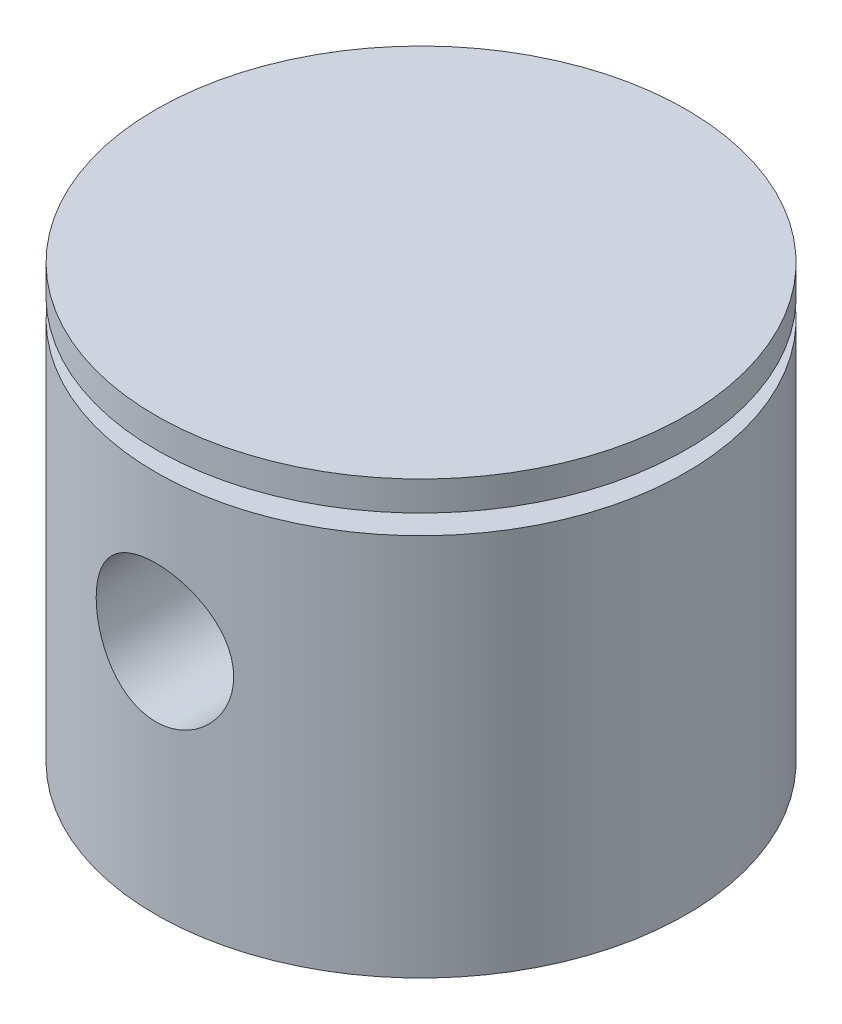
ISO-10303-21;
HEADER;
FILE_DESCRIPTION(('STEP AP214'),'2;1');
FILE_NAME('part.step','',(''),(''),'','','');
FILE_SCHEMA(('AUTOMOTIVE_DESIGN { 1 0 10303 214 1 1 1 1 }'));
ENDSEC;
DATA;
#1=APPLICATION_CONTEXT('core data for automotive mechanical design processes');
#2=APPLICATION_PROTOCOL_DEFINITION('international standard','automotive_design',2000,#1);
#3=PRODUCT_CONTEXT('',#1,'mechanical');
#4=PRODUCT('Part','Part','',(#3));
#5=PRODUCT_RELATED_PRODUCT_CATEGORY('part','',(#4));
#6=PRODUCT_DEFINITION_FORMATION('','',#4);
#7=PRODUCT_DEFINITION_CONTEXT('part definition',#1,'design');
#8=PRODUCT_DEFINITION('design','',#6,#7);
#9=PRODUCT_DEFINITION_SHAPE('','',#8);
#10=(LENGTH_UNIT() NAMED_UNIT(*) SI_UNIT(.MILLI.,.METRE.));
#11=(NAMED_UNIT(*) PLANE_ANGLE_UNIT() SI_UNIT($,.RADIAN.));
#12=(NAMED_UNIT(*) SI_UNIT($,.STERADIAN.) SOLID_ANGLE_UNIT());
#13=UNCERTAINTY_MEASURE_WITH_UNIT(LENGTH_MEASURE(1.E-05),#10,'distance_accuracy_value','');
#14=(GEOMETRIC_REPRESENTATION_CONTEXT(3) GLOBAL_UNCERTAINTY_ASSIGNED_CONTEXT((#13)) GLOBAL_UNIT_ASSIGNED_CONTEXT((#10,
#11,#12)) REPRESENTATION_CONTEXT('',''));
#15=CARTESIAN_POINT('',(0.,0.,0.));
#16=DIRECTION('',(0.,0.,1.));
#17=DIRECTION('',(1.,0.,0.));
#18=AXIS2_PLACEMENT_3D('',#15,#16,#17);
#19=CARTESIAN_POINT('',(0.,-3.,0.));
#20=DIRECTION('',(0.,-1.,0.));
#21=DIRECTION('',(1.,0.,0.));
#22=AXIS2_PLACEMENT_3D('',#19,#20,#21);
#23=PLANE('',#22);
#24=CARTESIAN_POINT('',(0.,-3.,0.));
#25=DIRECTION('',(0.,1.,0.));
#26=DIRECTION('',(-1.,0.,0.));
#27=AXIS2_PLACEMENT_3D('',#24,#25,#26);
#28=CIRCLE('',#27,7.);
#29=CARTESIAN_POINT('',(-7.,-3.,0.));
#30=VERTEX_POINT('',#29);
#31=EDGE_CURVE('E54',#30,#30,#28,.T.);
#32=ORIENTED_EDGE('',*,*,#31,.F.);
#33=EDGE_LOOP('',(#32));
#34=FACE_BOUND('',#33,.T.);
#35=ADVANCED_FACE('F37',(#34),#23,.T.);
#36=CARTESIAN_POINT('',(0.,0.,0.));
#37=DIRECTION('',(0.,1.,0.));
#38=DIRECTION('',(-1.,0.,0.));
#39=AXIS2_PLACEMENT_3D('',#36,#37,#38);
#40=CYLINDRICAL_SURFACE('',#39,7.);
#41=CARTESIAN_POINT('',(3.5,-10.,-6.06217782649107));
#42=CARTESIAN_POINT('',(3.49999956339732,-9.90876783970011,-6.06217838000061));
#43=CARTESIAN_POINT('',(3.49642792389145,-9.81752756193152,-6.06424447605956));
#44=CARTESIAN_POINT('',(3.48218913508999,-9.63575134944973,-6.07243150824313));
#45=CARTESIAN_POINT('',(3.47151868246889,-9.54521576250594,-6.07855433209936));
#46=CARTESIAN_POINT('',(3.44319969467244,-9.36544050175365,-6.09464039096269));
#47=CARTESIAN_POINT('',(3.42554021516251,-9.27620308911414,-6.10460964860236));
#48=CARTESIAN_POINT('',(3.38346810867625,-9.09978777983006,-6.12802725620062));
#49=CARTESIAN_POINT('',(3.35905254712794,-9.01261079605429,-6.1414771178296));
#50=CARTESIAN_POINT('',(3.27637383514563,-8.75602192255572,-6.18621982567766));
#51=CARTESIAN_POINT('',(3.20849068342823,-8.59038611188811,-6.22201962971363));
#52=CARTESIAN_POINT('',(3.04943048822246,-8.2729878953145,-6.30149515669602));
#53=CARTESIAN_POINT('',(2.95825218456469,-8.12122624054502,-6.34517130568186));
#54=CARTESIAN_POINT('',(2.74633222566438,-7.82193734720967,-6.43989014203716));
#55=CARTESIAN_POINT('',(2.62377249633984,-7.67579173048744,-6.49124329448661));
#56=CARTESIAN_POINT('',(2.35639796160147,-7.40507193587529,-6.59301832981094));
#57=CARTESIAN_POINT('',(2.21157212276479,-7.28050851795815,-6.64343973703042));
#58=CARTESIAN_POINT('',(1.89167303586647,-7.04820153552738,-6.74175654692166));
#59=CARTESIAN_POINT('',(1.71521894349515,-6.94215773518304,-6.7892525767614));
#60=CARTESIAN_POINT('',(1.43717634193612,-6.80700858315573,-6.85154168585872));
#61=CARTESIAN_POINT('',(1.34223033670876,-6.7659340128136,-6.87081779646072));
#62=CARTESIAN_POINT('',(1.14851918972932,-6.69218805949904,-6.9058351653357));
#63=CARTESIAN_POINT('',(1.0497562291509,-6.65951195662547,-6.92157840843028));
#64=CARTESIAN_POINT('',(0.856293047271141,-6.6049828946943,-6.94806564699471));
#65=CARTESIAN_POINT('',(0.761799423918771,-6.58252796537021,-6.95908444384902));
#66=CARTESIAN_POINT('',(0.570959543899398,-6.54551790662552,-6.97733380252561));
#67=CARTESIAN_POINT('',(0.474614217683192,-6.53095891180554,-6.98456621788415));
#68=CARTESIAN_POINT('',(0.28084967475871,-6.50992661060362,-6.99503586222835));
#69=CARTESIAN_POINT('',(0.183430773988689,-6.50345098628892,-6.99827423651508));
#70=CARTESIAN_POINT('',(-0.0116273304509103,-6.49865764739087,-7.00067156571555));
#71=CARTESIAN_POINT('',(-0.109266520276703,-6.50033943369514,-6.9998307702139));
#72=CARTESIAN_POINT('',(-0.384295104683939,-6.51662506134215,-6.99169222403876));
#73=CARTESIAN_POINT('',(-0.56109238024675,-6.54073623666047,-6.97964409624937));
#74=CARTESIAN_POINT('',(-0.907630020967151,-6.61507977109196,-6.94310184431136));
#75=CARTESIAN_POINT('',(-1.07736985703299,-6.66531408484058,-6.91860678883803));
#76=CARTESIAN_POINT('',(-1.4080742192286,-6.79079002209367,-6.85900450614999));
#77=CARTESIAN_POINT('',(-1.56888484366596,-6.86636801677066,-6.82375514375715));
#78=CARTESIAN_POINT('',(-1.8759209447004,-7.03992103570679,-6.7458179194099));
#79=CARTESIAN_POINT('',(-2.02214117261598,-7.1379040784298,-6.70312739566786));
#80=CARTESIAN_POINT('',(-2.31060792075682,-7.36413662334202,-6.60955344260832));
#81=CARTESIAN_POINT('',(-2.45117227638486,-7.49437161463084,-6.55827701738784));
#82=CARTESIAN_POINT('',(-2.70936227995222,-7.7760530133303,-6.45590306396165));
#83=CARTESIAN_POINT('',(-2.82697027930841,-7.92751558778296,-6.40480570282283));
#84=CARTESIAN_POINT('',(-3.04328139203151,-8.25931250598308,-6.30504098213601));
#85=CARTESIAN_POINT('',(-3.14030968987606,-8.44086950924457,-6.25673399939454));
#86=CARTESIAN_POINT('',(-3.26133310964906,-8.72549023026427,-6.19401060186596));
#87=CARTESIAN_POINT('',(-3.2975926372931,-8.82243236278298,-6.1747227090965));
#88=CARTESIAN_POINT('',(-3.36153180341711,-9.01977670447694,-6.14014885681131));
#89=CARTESIAN_POINT('',(-3.38921673273672,-9.12017673732865,-6.12486043038762));
#90=CARTESIAN_POINT('',(-3.43377916012519,-9.3156002235405,-6.09998031990017));
#91=CARTESIAN_POINT('',(-3.45133612498609,-9.41042432985663,-6.09003479308439));
#92=CARTESIAN_POINT('',(-3.47857887058632,-9.6015077784056,-6.074515266829));
#93=CARTESIAN_POINT('',(-3.48826874466199,-9.69776634768537,-6.06893899406988));
#94=CARTESIAN_POINT('',(-3.49963441115529,-9.89088284126757,-6.0623927334111));
#95=CARTESIAN_POINT('',(-3.50131318771324,-9.9877405289337,-6.06142103030644));
#96=CARTESIAN_POINT('',(-3.4966486629301,-10.1811675375594,-6.06411112066564));
#97=CARTESIAN_POINT('',(-3.49030590307485,-10.2777368775425,-6.06777260137102));
#98=CARTESIAN_POINT('',(-3.46161824436789,-10.5446689920494,-6.08421908511994));
#99=CARTESIAN_POINT('',(-3.43065523616977,-10.7138959453071,-6.10189020770591));
#100=CARTESIAN_POINT('',(-3.344939119225,-11.0443193959298,-6.14928610781903));
#101=CARTESIAN_POINT('',(-3.29017830614363,-11.205513273802,-6.1790147886689));
#102=CARTESIAN_POINT('',(-3.15576595224878,-11.5239304545732,-6.2487691031854));
#103=CARTESIAN_POINT('',(-3.07507905936516,-11.6806240825548,-6.28920787148186));
#104=CARTESIAN_POINT('',(-2.89200488769887,-11.9791449280937,-6.37546382424484));
#105=CARTESIAN_POINT('',(-2.78960646141122,-12.1209644526134,-6.42128376619316));
#106=CARTESIAN_POINT('',(-2.55093003311768,-12.4044248977372,-6.52008005997018));
#107=CARTESIAN_POINT('',(-2.41200843915967,-12.54378981605,-6.57323044098861));
#108=CARTESIAN_POINT('',(-2.11191574784142,-12.7979430445106,-6.67569819362743));
#109=CARTESIAN_POINT('',(-1.95073716497934,-12.9127230529547,-6.72501426692928));
#110=CARTESIAN_POINT('',(-1.60487376517276,-13.1170079821693,-6.81594766774415));
#111=CARTESIAN_POINT('',(-1.41968084087147,-13.2057658988636,-6.85732746098029));
#112=CARTESIAN_POINT('',(-1.03432827688115,-13.3499826783623,-6.92591742111843));
#113=CARTESIAN_POINT('',(-0.834181953644696,-13.4054707806489,-6.95314002739456));
#114=CARTESIAN_POINT('',(-0.444428889271712,-13.476789973824,-6.98836278752708));
#115=CARTESIAN_POINT('',(-0.255540058258723,-13.4957925748211,-6.99789747919145));
#116=CARTESIAN_POINT('',(0.122940955609663,-13.502951419839,-7.00147456072567));
#117=CARTESIAN_POINT('',(0.312532869036784,-13.4911184620464,-6.99552237388753));
#118=CARTESIAN_POINT('',(0.6738829562924,-13.4390426115115,-6.96968891722386));
#119=CARTESIAN_POINT('',(0.84599305145653,-13.4007231560588,-6.9507513418277));
#120=CARTESIAN_POINT('',(1.18106089353429,-13.2993553739606,-6.90172324976767));
#121=CARTESIAN_POINT('',(1.34401732410582,-13.2363035010262,-6.87163113372997));
#122=CARTESIAN_POINT('',(1.66398168539689,-13.0844558165377,-6.80140768663223));
#123=CARTESIAN_POINT('',(1.82043709959406,-12.9946742682378,-6.76090202225989));
#124=CARTESIAN_POINT('',(2.11671214661927,-12.793145341654,-6.67408423946858));
#125=CARTESIAN_POINT('',(2.25652409118354,-12.6813878745669,-6.62776945772402));
#126=CARTESIAN_POINT('',(2.53019531440925,-12.4262178238933,-6.52850308617827));
#127=CARTESIAN_POINT('',(2.66207744722746,-12.2807617929154,-6.47534971402989));
#128=CARTESIAN_POINT('',(2.90033596726623,-11.9688919500998,-6.37220091113588));
#129=CARTESIAN_POINT('',(3.00668978938671,-11.8024597936472,-6.32220830280382));
#130=CARTESIAN_POINT('',(3.14609819272059,-11.5370462420862,-6.25338904021468));
#131=CARTESIAN_POINT('',(3.18972977002774,-11.4443615682368,-6.23118088900335));
#132=CARTESIAN_POINT('',(3.26889800450942,-11.2549211671086,-6.19001580347162));
#133=CARTESIAN_POINT('',(3.30443883130347,-11.158167567375,-6.17105719572879));
#134=CARTESIAN_POINT('',(3.36691395764373,-10.9615144887952,-6.13719418126031));
#135=CARTESIAN_POINT('',(3.39387039794445,-10.8616238450393,-6.1222793598748));
#136=CARTESIAN_POINT('',(3.43889497857826,-10.6593354986716,-6.09710349334749));
#137=CARTESIAN_POINT('',(3.45696933329418,-10.5569396016766,-6.08683919484421));
#138=CARTESIAN_POINT('',(3.48027615598229,-10.3787014791471,-6.07353278780424));
#139=CARTESIAN_POINT('',(3.48766550855654,-10.3032230485278,-6.06928503621558));
#140=CARTESIAN_POINT('',(3.4975277766738,-10.151831638126,-6.06360723100921));
#141=CARTESIAN_POINT('',(3.50000036331791,-10.0759186296137,-6.06217736588939));
#142=CARTESIAN_POINT('',(3.5,-10.,-6.06217782649107));
#143=B_SPLINE_CURVE_WITH_KNOTS('',3,(#41,#42,#43,#44,#45,#46,#47,#48,#49,#50,#51,#52,#53,#54,
#55,#56,#57,#58,#59,#60,#61,#62,#63,#64,#65,#66,#67,#68,#69,#70,#71,#72,#73,#74,#75,#76,#77,#78,
#79,#80,#81,#82,#83,#84,#85,#86,#87,#88,#89,#90,#91,#92,#93,#94,#95,#96,#97,#98,#99,#100,#101,
#102,#103,#104,#105,#106,#107,#108,#109,#110,#111,#112,#113,#114,#115,#116,#117,#118,#119,#120,
#121,#122,#123,#124,#125,#126,#127,#128,#129,#130,#131,#132,#133,#134,#135,#136,#137,#138,#139,
#140,#141,#142),.UNSPECIFIED.,.T.,.F.,(4,2,2,2,2,2,2,2,2,2,2,2,2,2,2,2,2,2,2,2,2,2,2,2,2,2,2,2,
2,2,2,2,2,2,2,2,2,2,2,2,2,2,2,2,2,2,2,2,2,2,4),(0.,0.273617669189538,0.547362751371639,
0.821538206448543,1.09583293983044,1.64090790070131,2.18601235407281,2.77607590875861,
3.36643280296777,3.99658404337151,4.31189694333943,4.62703224947414,4.91988214563307,
5.21258854947495,5.5052109995082,5.79781554561911,6.33156812856655,6.86536065471864,
7.40653843219784,7.94791019386722,8.54045641759888,9.13345640521485,9.7641141771384,
10.0795717502392,10.3948342849403,10.6852664033651,10.9755473096532,11.2657200776223,
11.5558732588124,12.0721264170602,12.5885468324815,13.1288853714324,13.669502014921,
14.2782660225408,14.8872352714564,15.5122763466731,16.1367672905263,16.7039594608513,
17.2709530350083,17.8005848677215,18.3302926701398,18.8826562724008,19.4352740507445,
20.0428884619717,20.6510379967997,20.9651345817897,21.2790689268034,21.592186891934,
21.9050854699481,22.1327605463739,22.3604508522341),.UNSPECIFIED.);
#144=CARTESIAN_POINT('',(3.5,-10.,-6.06217782649107));
#145=VERTEX_POINT('',#144);
#146=EDGE_CURVE('E88',#145,#145,#143,.T.);
#147=ORIENTED_EDGE('',*,*,#146,.F.);
#148=EDGE_LOOP('',(#147));
#149=FACE_BOUND('',#148,.T.);
#150=CARTESIAN_POINT('',(3.5,-10.,6.06217782649107));
#151=CARTESIAN_POINT('',(3.49999956339732,-10.0912321602999,6.06217838000061));
#152=CARTESIAN_POINT('',(3.49642792389145,-10.1824724380685,6.06424447605956));
#153=CARTESIAN_POINT('',(3.48218913508999,-10.3642486505503,6.07243150824313));
#154=CARTESIAN_POINT('',(3.47151868246889,-10.4547842374941,6.07855433209936));
#155=CARTESIAN_POINT('',(3.44319969467244,-10.6345594982463,6.09464039096269));
#156=CARTESIAN_POINT('',(3.42554021516251,-10.7237969108859,6.10460964860236));
#157=CARTESIAN_POINT('',(3.38346810867625,-10.9002122201699,6.12802725620062));
#158=CARTESIAN_POINT('',(3.35905254712794,-10.9873892039457,6.1414771178296));
#159=CARTESIAN_POINT('',(3.27637383514563,-11.2439780774443,6.18621982567766));
#160=CARTESIAN_POINT('',(3.20849068342823,-11.4096138881119,6.22201962971363));
#161=CARTESIAN_POINT('',(3.04943048822246,-11.7270121046855,6.30149515669602));
#162=CARTESIAN_POINT('',(2.95825218456469,-11.878773759455,6.34517130568186));
#163=CARTESIAN_POINT('',(2.74633222566438,-12.1780626527903,6.43989014203716));
#164=CARTESIAN_POINT('',(2.62377249633984,-12.3242082695126,6.49124329448661));
#165=CARTESIAN_POINT('',(2.35639796160147,-12.5949280641247,6.59301832981094));
#166=CARTESIAN_POINT('',(2.21157212276479,-12.7194914820418,6.64343973703042));
#167=CARTESIAN_POINT('',(1.89167303586647,-12.9517984644726,6.74175654692166));
#168=CARTESIAN_POINT('',(1.71521894349515,-13.057842264817,6.7892525767614));
#169=CARTESIAN_POINT('',(1.43717634193612,-13.1929914168443,6.85154168585872));
#170=CARTESIAN_POINT('',(1.34223033670876,-13.2340659871864,6.87081779646072));
#171=CARTESIAN_POINT('',(1.14851918972932,-13.307811940501,6.9058351653357));
#172=CARTESIAN_POINT('',(1.0497562291509,-13.3404880433745,6.92157840843028));
#173=CARTESIAN_POINT('',(0.856293047271142,-13.3950171053057,6.94806564699471));
#174=CARTESIAN_POINT('',(0.761799423918771,-13.4174720346298,6.95908444384902));
#175=CARTESIAN_POINT('',(0.570959543899398,-13.4544820933745,6.97733380252561));
#176=CARTESIAN_POINT('',(0.474614217683192,-13.4690410881945,6.98456621788415));
#177=CARTESIAN_POINT('',(0.28084967475871,-13.4900733893964,6.99503586222835));
#178=CARTESIAN_POINT('',(0.18343077398869,-13.4965490137111,6.99827423651509));
#179=CARTESIAN_POINT('',(-0.01162733045091,-13.5013423526091,7.00067156571555));
#180=CARTESIAN_POINT('',(-0.109266520276702,-13.4996605663049,6.9998307702139));
#181=CARTESIAN_POINT('',(-0.384295104683938,-13.4833749386579,6.99169222403876));
#182=CARTESIAN_POINT('',(-0.56109238024675,-13.4592637633395,6.97964409624937));
#183=CARTESIAN_POINT('',(-0.90763002096715,-13.384920228908,6.94310184431136));
#184=CARTESIAN_POINT('',(-1.07736985703299,-13.3346859151594,6.91860678883803));
#185=CARTESIAN_POINT('',(-1.4080742192286,-13.2092099779063,6.85900450614999));
#186=CARTESIAN_POINT('',(-1.56888484366596,-13.1336319832293,6.82375514375715));
#187=CARTESIAN_POINT('',(-1.8759209447004,-12.9600789642932,6.7458179194099));
#188=CARTESIAN_POINT('',(-2.02214117261598,-12.8620959215702,6.70312739566786));
#189=CARTESIAN_POINT('',(-2.31060792075682,-12.635863376658,6.60955344260832));
#190=CARTESIAN_POINT('',(-2.45117227638486,-12.5056283853692,6.55827701738784));
#191=CARTESIAN_POINT('',(-2.70936227995222,-12.2239469866697,6.45590306396165));
#192=CARTESIAN_POINT('',(-2.82697027930841,-12.072484412217,6.40480570282283));
#193=CARTESIAN_POINT('',(-3.04328139203151,-11.7406874940169,6.30504098213601));
#194=CARTESIAN_POINT('',(-3.14030968987606,-11.5591304907554,6.25673399939454));
#195=CARTESIAN_POINT('',(-3.26133310964906,-11.2745097697357,6.19401060186596));
#196=CARTESIAN_POINT('',(-3.2975926372931,-11.177567637217,6.1747227090965));
#197=CARTESIAN_POINT('',(-3.36153180341711,-10.9802232955231,6.14014885681131));
#198=CARTESIAN_POINT('',(-3.38921673273672,-10.8798232626714,6.12486043038763));
#199=CARTESIAN_POINT('',(-3.43377916012519,-10.6843997764595,6.09998031990017));
#200=CARTESIAN_POINT('',(-3.45133612498609,-10.5895756701434,6.09003479308439));
#201=CARTESIAN_POINT('',(-3.47857887058632,-10.3984922215944,6.074515266829));
#202=CARTESIAN_POINT('',(-3.48826874466199,-10.3022336523146,6.06893899406988));
#203=CARTESIAN_POINT('',(-3.49963441115529,-10.1091171587324,6.0623927334111));
#204=CARTESIAN_POINT('',(-3.50131318771324,-10.0122594710663,6.06142103030645));
#205=CARTESIAN_POINT('',(-3.4966486629301,-9.81883246244062,6.06411112066564));
#206=CARTESIAN_POINT('',(-3.49030590307485,-9.72226312245752,6.06777260137102));
#207=CARTESIAN_POINT('',(-3.46161824436789,-9.45533100795056,6.08421908511993));
#208=CARTESIAN_POINT('',(-3.43065523616977,-9.28610405469295,6.10189020770591));
#209=CARTESIAN_POINT('',(-3.344939119225,-8.95568060407022,6.14928610781903));
#210=CARTESIAN_POINT('',(-3.29017830614363,-8.79448672619804,6.1790147886689));
#211=CARTESIAN_POINT('',(-3.15576595224878,-8.47606954542678,6.2487691031854));
#212=CARTESIAN_POINT('',(-3.07507905936516,-8.31937591744523,6.28920787148186));
#213=CARTESIAN_POINT('',(-2.89200488769887,-8.02085507190628,6.37546382424484));
#214=CARTESIAN_POINT('',(-2.78960646141122,-7.87903554738662,6.42128376619316));
#215=CARTESIAN_POINT('',(-2.55093003311768,-7.59557510226283,6.52008005997018));
#216=CARTESIAN_POINT('',(-2.41200843915967,-7.45621018394997,6.57323044098861));
#217=CARTESIAN_POINT('',(-2.11191574784142,-7.20205695548936,6.67569819362743));
#218=CARTESIAN_POINT('',(-1.95073716497933,-7.08727694704525,6.72501426692928));
#219=CARTESIAN_POINT('',(-1.60487376517276,-6.88299201783074,6.81594766774415));
#220=CARTESIAN_POINT('',(-1.41968084087147,-6.79423410113638,6.85732746098029));
#221=CARTESIAN_POINT('',(-1.03432827688115,-6.65001732163765,6.92591742111843));
#222=CARTESIAN_POINT('',(-0.834181953644696,-6.5945292193511,6.95314002739456));
#223=CARTESIAN_POINT('',(-0.444428889271711,-6.52321002617599,6.98836278752708));
#224=CARTESIAN_POINT('',(-0.255540058258722,-6.50420742517892,6.99789747919145));
#225=CARTESIAN_POINT('',(0.122940955609664,-6.49704858016104,7.00147456072567));
#226=CARTESIAN_POINT('',(0.312532869036785,-6.50888153795358,6.99552237388753));
#227=CARTESIAN_POINT('',(0.6738829562924,-6.56095738848853,6.96968891722386));
#228=CARTESIAN_POINT('',(0.845993051456531,-6.59927684394123,6.9507513418277));
#229=CARTESIAN_POINT('',(1.18106089353429,-6.70064462603944,6.90172324976767));
#230=CARTESIAN_POINT('',(1.34401732410582,-6.76369649897383,6.87163113372996));
#231=CARTESIAN_POINT('',(1.66398168539689,-6.91554418346227,6.80140768663223));
#232=CARTESIAN_POINT('',(1.82043709959406,-7.00532573176215,6.76090202225989));
#233=CARTESIAN_POINT('',(2.11671214661927,-7.20685465834602,6.67408423946858));
#234=CARTESIAN_POINT('',(2.25652409118354,-7.31861212543305,6.62776945772402));
#235=CARTESIAN_POINT('',(2.53019531440925,-7.5737821761067,6.52850308617827));
#236=CARTESIAN_POINT('',(2.66207744722746,-7.71923820708463,6.47534971402989));
#237=CARTESIAN_POINT('',(2.90033596726623,-8.03110804990017,6.37220091113588));
#238=CARTESIAN_POINT('',(3.00668978938671,-8.19754020635281,6.32220830280382));
#239=CARTESIAN_POINT('',(3.14609819272059,-8.46295375791379,6.25338904021468));
#240=CARTESIAN_POINT('',(3.18972977002774,-8.55563843176316,6.23118088900335));
#241=CARTESIAN_POINT('',(3.26889800450942,-8.74507883289145,6.19001580347162));
#242=CARTESIAN_POINT('',(3.30443883130347,-8.84183243262497,6.17105719572879));
#243=CARTESIAN_POINT('',(3.36691395764373,-9.03848551120479,6.13719418126031));
#244=CARTESIAN_POINT('',(3.39387039794445,-9.13837615496071,6.1222793598748));
#245=CARTESIAN_POINT('',(3.43889497857826,-9.34066450132838,6.09710349334749));
#246=CARTESIAN_POINT('',(3.45696933329418,-9.44306039832341,6.08683919484421));
#247=CARTESIAN_POINT('',(3.48027615598229,-9.62129852085289,6.07353278780424));
#248=CARTESIAN_POINT('',(3.48766550855654,-9.6967769514722,6.06928503621558));
#249=CARTESIAN_POINT('',(3.4975277766738,-9.84816836187403,6.06360723100921));
#250=CARTESIAN_POINT('',(3.50000036331791,-9.92408137038627,6.06217736588939));
#251=CARTESIAN_POINT('',(3.5,-10.,6.06217782649107));
#252=B_SPLINE_CURVE_WITH_KNOTS('',3,(#150,#151,#152,#153,#154,#155,#156,#157,#158,#159,#160,
#161,#162,#163,#164,#165,#166,#167,#168,#169,#170,#171,#172,#173,#174,#175,#176,#177,#178,#179,
#180,#181,#182,#183,#184,#185,#186,#187,#188,#189,#190,#191,#192,#193,#194,#195,#196,#197,#198,
#199,#200,#201,#202,#203,#204,#205,#206,#207,#208,#209,#210,#211,#212,#213,#214,#215,#216,#217,
#218,#219,#220,#221,#222,#223,#224,#225,#226,#227,#228,#229,#230,#231,#232,#233,#234,#235,#236,
#237,#238,#239,#240,#241,#242,#243,#244,#245,#246,#247,#248,#249,#250,#251),.UNSPECIFIED.,.T.,
.F.,(4,2,2,2,2,2,2,2,2,2,2,2,2,2,2,2,2,2,2,2,2,2,2,2,2,2,2,2,2,2,2,2,2,2,2,2,2,2,2,2,2,2,2,2,2,
2,2,2,2,2,4),(0.,0.273617669189538,0.547362751371639,0.821538206448543,1.09583293983044,
1.64090790070131,2.18601235407281,2.7760759087586,3.36643280296777,3.99658404337151,
4.31189694333943,4.62703224947414,4.91988214563307,5.21258854947495,5.50521099950819,
5.7978155456191,6.33156812856654,6.86536065471863,7.40653843219783,7.94791019386722,
8.54045641759887,9.13345640521485,9.7641141771384,10.0795717502392,10.3948342849403,
10.6852664033651,10.9755473096532,11.2657200776223,11.5558732588124,12.0721264170602,
12.5885468324815,13.1288853714324,13.669502014921,14.2782660225408,14.8872352714564,
15.5122763466731,16.1367672905263,16.7039594608513,17.2709530350083,17.8005848677215,
18.3302926701398,18.8826562724008,19.4352740507445,20.0428884619717,20.6510379967997,
20.9651345817896,21.2790689268034,21.592186891934,21.9050854699481,22.1327605463739,
22.3604508522341),.UNSPECIFIED.);
#253=CARTESIAN_POINT('',(3.5,-10.,6.06217782649107));
#254=VERTEX_POINT('',#253);
#255=EDGE_CURVE('E82',#254,#254,#252,.T.);
#256=ORIENTED_EDGE('',*,*,#255,.F.);
#257=EDGE_LOOP('',(#256));
#258=FACE_BOUND('',#257,.T.);
#259=ORIENTED_EDGE('',*,*,#31,.T.);
#260=EDGE_LOOP('',(#259));
#261=FACE_BOUND('',#260,.T.);
#262=CARTESIAN_POINT('',(0.,-16.,0.));
#263=DIRECTION('',(0.,1.,0.));
#264=DIRECTION('',(-1.,0.,0.));
#265=AXIS2_PLACEMENT_3D('',#262,#263,#264);
#266=CIRCLE('',#265,7.);
#267=CARTESIAN_POINT('',(-7.,-16.,0.));
#268=VERTEX_POINT('',#267);
#269=EDGE_CURVE('E59',#268,#268,#266,.T.);
#270=ORIENTED_EDGE('',*,*,#269,.F.);
#271=EDGE_LOOP('',(#270));
#272=FACE_BOUND('',#271,.T.);
#273=ADVANCED_FACE('F93',(#149,#258,#261,#272),#40,.F.);
#274=CARTESIAN_POINT('',(-7.,-16.,0.));
#275=DIRECTION('',(0.,-1.,0.));
#276=DIRECTION('',(1.,0.,0.));
#277=AXIS2_PLACEMENT_3D('',#274,#275,#276);
#278=PLANE('',#277);
#279=ORIENTED_EDGE('',*,*,#269,.T.);
#280=EDGE_LOOP('',(#279));
#281=FACE_BOUND('',#280,.T.);
#282=CARTESIAN_POINT('',(0.,-16.,0.));
#283=DIRECTION('',(0.,1.,0.));
#284=DIRECTION('',(-1.,0.,0.));
#285=AXIS2_PLACEMENT_3D('',#282,#283,#284);
#286=CIRCLE('',#285,12.);
#287=CARTESIAN_POINT('',(-12.,-16.,0.));
#288=VERTEX_POINT('',#287);
#289=EDGE_CURVE('E126',#288,#288,#286,.T.);
#290=ORIENTED_EDGE('',*,*,#289,.F.);
#291=EDGE_LOOP('',(#290));
#292=FACE_BOUND('',#291,.T.);
#293=ADVANCED_FACE('F97',(#281,#292),#278,.T.);
#294=CARTESIAN_POINT('',(0.,0.,0.));
#295=DIRECTION('',(0.,1.,0.));
#296=DIRECTION('',(-1.,0.,0.));
#297=AXIS2_PLACEMENT_3D('',#294,#295,#296);
#298=CYLINDRICAL_SURFACE('',#297,12.);
#299=ORIENTED_EDGE('',*,*,#289,.T.);
#300=EDGE_LOOP('',(#299));
#301=FACE_BOUND('',#300,.T.);
#302=CARTESIAN_POINT('',(0.,-22.,0.));
#303=DIRECTION('',(0.,1.,0.));
#304=DIRECTION('',(-1.,0.,0.));
#305=AXIS2_PLACEMENT_3D('',#302,#303,#304);
#306=CIRCLE('',#305,12.);
#307=CARTESIAN_POINT('',(-12.,-22.,0.));
#308=VERTEX_POINT('',#307);
#309=EDGE_CURVE('E129',#308,#308,#306,.T.);
#310=ORIENTED_EDGE('',*,*,#309,.F.);
#311=EDGE_LOOP('',(#310));
#312=FACE_BOUND('',#311,.T.);
#313=ADVANCED_FACE('F102',(#301,#312),#298,.F.);
#314=CARTESIAN_POINT('',(-12.,-22.,0.));
#315=DIRECTION('',(0.,-1.,0.));
#316=DIRECTION('',(1.,0.,0.));
#317=AXIS2_PLACEMENT_3D('',#314,#315,#316);
#318=PLANE('',#317);
#319=ORIENTED_EDGE('',*,*,#309,.T.);
#320=EDGE_LOOP('',(#319));
#321=FACE_BOUND('',#320,.T.);
#322=CARTESIAN_POINT('',(0.,-22.,0.));
#323=DIRECTION('',(0.,1.,0.));
#324=DIRECTION('',(-1.,0.,0.));
#325=AXIS2_PLACEMENT_3D('',#322,#323,#324);
#326=CIRCLE('',#325,13.5);
#327=CARTESIAN_POINT('',(-13.5,-22.,0.));
#328=VERTEX_POINT('',#327);
#329=EDGE_CURVE('E134',#328,#328,#326,.T.);
#330=ORIENTED_EDGE('',*,*,#329,.F.);
#331=EDGE_LOOP('',(#330));
#332=FACE_BOUND('',#331,.T.);
#333=ADVANCED_FACE('F105',(#321,#332),#318,.T.);
#334=CARTESIAN_POINT('',(0.,0.,0.));
#335=DIRECTION('',(0.,1.,0.));
#336=DIRECTION('',(-1.,0.,0.));
#337=AXIS2_PLACEMENT_3D('',#334,#335,#336);
#338=CYLINDRICAL_SURFACE('',#337,13.5);
#339=CARTESIAN_POINT('',(0.,-6.5,-13.5));
#340=CARTESIAN_POINT('',(0.19314061824047,-6.50000497623003,-13.4999969118576));
#341=CARTESIAN_POINT('',(0.386335548600797,-6.51604081275947,-13.495814170209));
#342=CARTESIAN_POINT('',(0.767172830073046,-6.57965484455771,-13.4795341776931));
#343=CARTESIAN_POINT('',(0.954812241983917,-6.62724943543445,-13.4674328129346));
#344=CARTESIAN_POINT('',(1.31898516387816,-6.75233929239007,-13.4366532216563));
#345=CARTESIAN_POINT('',(1.49553223227796,-6.82979719510649,-13.4179832160074));
#346=CARTESIAN_POINT('',(1.83312840695162,-7.01227958757246,-13.3760463121345));
#347=CARTESIAN_POINT('',(1.99417670750589,-7.11730550941738,-13.3527791751155));
#348=CARTESIAN_POINT('',(2.29975008536733,-7.35438489573935,-13.303593478471));
#349=CARTESIAN_POINT('',(2.44388524492371,-7.48693195221371,-13.2776315710013));
#350=CARTESIAN_POINT('',(2.70814962316903,-7.77423520419556,-13.2262650620559));
#351=CARTESIAN_POINT('',(2.8282759273548,-7.92899409214735,-13.2008605285742));
#352=CARTESIAN_POINT('',(3.04298331037743,-8.25940197698554,-13.1530446726781));
#353=CARTESIAN_POINT('',(3.13712142606622,-8.43534748536271,-13.1306881969627));
#354=CARTESIAN_POINT('',(3.29432911152367,-8.80124085716215,-13.0921347637907));
#355=CARTESIAN_POINT('',(3.35740406315247,-8.99118628846177,-13.0759367394603));
#356=CARTESIAN_POINT('',(3.44935160693337,-9.37538307546551,-13.0519808457498));
#357=CARTESIAN_POINT('',(3.4789285193535,-9.56945479309506,-13.0440494614227));
#358=CARTESIAN_POINT('',(3.50523535158572,-9.95995512124099,-13.0370060198732));
#359=CARTESIAN_POINT('',(3.50197104725124,-10.1563833112503,-13.0378924118498));
#360=CARTESIAN_POINT('',(3.46324852342107,-10.5405685448675,-13.0482287650372));
#361=CARTESIAN_POINT('',(3.42863664579192,-10.7284179051792,-13.0574535871974));
#362=CARTESIAN_POINT('',(3.32955455249235,-11.0955480289107,-13.0830676738746));
#363=CARTESIAN_POINT('',(3.26508206729865,-11.2748281398913,-13.0994574829533));
#364=CARTESIAN_POINT('',(3.10740504245194,-11.6219653161681,-13.1377566990292));
#365=CARTESIAN_POINT('',(3.0138990895262,-11.7896788688561,-13.1597235465776));
#366=CARTESIAN_POINT('',(2.80101992540441,-12.1073349693456,-13.2066701554281));
#367=CARTESIAN_POINT('',(2.681641876011,-12.2572741851428,-13.231650479876));
#368=CARTESIAN_POINT('',(2.41605424697535,-12.5399675521929,-13.28275142812));
#369=CARTESIAN_POINT('',(2.26913235624932,-12.6720513219462,-13.3088834932049));
#370=CARTESIAN_POINT('',(1.95490696772602,-12.9098383033989,-13.358652797065));
#371=CARTESIAN_POINT('',(1.78760275166081,-13.0155405850211,-13.3822899478651));
#372=CARTESIAN_POINT('',(1.43636065775993,-13.1978369544965,-13.424538661486));
#373=CARTESIAN_POINT('',(1.25236016504338,-13.2743153495452,-13.4431301669767));
#374=CARTESIAN_POINT('',(0.873523113344339,-13.3950639540042,-13.4730475021387));
#375=CARTESIAN_POINT('',(0.678688797378529,-13.4393408038388,-13.4843748297316));
#376=CARTESIAN_POINT('',(0.289440611157425,-13.4933898961058,-13.4982631892375));
#377=CARTESIAN_POINT('',(0.095161467153047,-13.5040742379557,-13.5010558918275));
#378=CARTESIAN_POINT('',(-0.292410889379296,-13.49314611493,-13.4982235923972));
#379=CARTESIAN_POINT('',(-0.485704195996525,-13.471536792345,-13.4925994093703));
#380=CARTESIAN_POINT('',(-0.862601390832053,-13.3973846195816,-13.4737143969592));
#381=CARTESIAN_POINT('',(-1.04631118311946,-13.3453454734944,-13.4605779934553));
#382=CARTESIAN_POINT('',(-1.4023795900627,-13.2123914455675,-13.428154098426));
#383=CARTESIAN_POINT('',(-1.57473700839017,-13.1314735261928,-13.4088659598699));
#384=CARTESIAN_POINT('',(-1.90679057696056,-12.941332944448,-13.365729768678));
#385=CARTESIAN_POINT('',(-2.06618831003627,-12.8316074557723,-13.34180291361));
#386=CARTESIAN_POINT('',(-2.36463043277793,-12.5876033053305,-13.2921574619827));
#387=CARTESIAN_POINT('',(-2.50367102246377,-12.4533200699704,-13.2664385322237));
#388=CARTESIAN_POINT('',(-2.76125748880094,-12.1597649566543,-13.2152634787224));
#389=CARTESIAN_POINT('',(-2.87916143139891,-11.9999244217702,-13.1898324495145));
#390=CARTESIAN_POINT('',(-3.08648035109913,-11.6621949268546,-13.1428680982705));
#391=CARTESIAN_POINT('',(-3.17589656032281,-11.4843067478396,-13.1213346076796));
#392=CARTESIAN_POINT('',(-3.32302956220912,-11.1164548277247,-13.0848470867192));
#393=CARTESIAN_POINT('',(-3.38093269547015,-10.926569648546,-13.0698544862503));
#394=CARTESIAN_POINT('',(-3.46386140485676,-10.5393067902196,-13.0481238755455));
#395=CARTESIAN_POINT('',(-3.4888948275355,-10.3419309108078,-13.0413838952964));
#396=CARTESIAN_POINT('',(-3.50494058655124,-9.95184322611046,-13.0370797649328));
#397=CARTESIAN_POINT('',(-3.49698200850121,-9.7591761607671,-13.0392380487562));
#398=CARTESIAN_POINT('',(-3.44964239462833,-9.37803220628321,-13.0518410665737));
#399=CARTESIAN_POINT('',(-3.41026208513713,-9.18955522039006,-13.062285609026));
#400=CARTESIAN_POINT('',(-3.30177814824579,-8.8233570900416,-13.090123774054));
#401=CARTESIAN_POINT('',(-3.23288127609558,-8.64557076040573,-13.1074690000536));
#402=CARTESIAN_POINT('',(-3.06748160331797,-8.30394934428448,-13.1471577847997));
#403=CARTESIAN_POINT('',(-2.9709746939479,-8.14011633895274,-13.1695020873676));
#404=CARTESIAN_POINT('',(-2.74992716601834,-7.82611249608418,-13.2174509317284));
#405=CARTESIAN_POINT('',(-2.62467893237102,-7.67645096309818,-13.2431290941895));
#406=CARTESIAN_POINT('',(-2.35106487858852,-7.3999351678843,-13.2944286968102));
#407=CARTESIAN_POINT('',(-2.20269350852271,-7.27308639687709,-13.3200501218507));
#408=CARTESIAN_POINT('',(-1.88348441707643,-7.0433262827603,-13.3689580790859));
#409=CARTESIAN_POINT('',(-1.71225863682153,-6.94094106418493,-13.3921880542304));
#410=CARTESIAN_POINT('',(-1.35443300202786,-6.766571156225,-13.4330873880808));
#411=CARTESIAN_POINT('',(-1.1678436399359,-6.69456592151504,-13.4507605027037));
#412=CARTESIAN_POINT('',(-0.818150001735752,-6.59298092245784,-13.4761206304321));
#413=CARTESIAN_POINT('',(-0.656626873830671,-6.558191487183,-13.4850118475553));
#414=CARTESIAN_POINT('',(-0.330082181464949,-6.51169991041239,-13.4969525961577));
#415=CARTESIAN_POINT('',(-0.165060924630276,-6.49999574723775,-13.5000026391737));
#416=CARTESIAN_POINT('',(0.,-6.5,-13.5));
#417=B_SPLINE_CURVE_WITH_KNOTS('',3,(#339,#340,#341,#342,#343,#344,#345,#346,#347,#348,#349,
#350,#351,#352,#353,#354,#355,#356,#357,#358,#359,#360,#361,#362,#363,#364,#365,#366,#367,#368,
#369,#370,#371,#372,#373,#374,#375,#376,#377,#378,#379,#380,#381,#382,#383,#384,#385,#386,#387,
#388,#389,#390,#391,#392,#393,#394,#395,#396,#397,#398,#399,#400,#401,#402,#403,#404,#405,#406,
#407,#408,#409,#410,#411,#412,#413,#414,#415,#416),.UNSPECIFIED.,.T.,.F.,(4,2,2,2,2,2,2,2,2,2,2,
2,2,2,2,2,2,2,2,2,2,2,2,2,2,2,2,2,2,2,2,2,2,2,2,2,2,2,4),(0.,0.578816731037029,1.15793440853858,
1.73632986436162,2.31475537245066,2.9046241204756,3.4945644309102,4.0940137522667,
4.69335917923681,5.27985434396532,5.86624636236673,6.43726366689068,7.00832437809299,
7.58552387267582,8.16283139941728,8.75789471497631,9.35297900648407,9.95039532118384,
10.5476884050378,11.1286172510857,11.7094895743333,12.2810085135565,12.852587584167,
13.4348964314833,14.0173138376752,14.6151900252453,15.2130403505929,15.8073160063315,
16.4014497726614,16.977193039237,17.5529229975568,18.1246844240645,18.6965309806137,
19.2843471197154,19.8723045621998,20.4719529521116,21.071195160247,21.5659041119515,
22.0605697378919),.UNSPECIFIED.);
#418=CARTESIAN_POINT('',(0.,-6.5,-13.5));
#419=VERTEX_POINT('',#418);
#420=EDGE_CURVE('E10',#419,#419,#417,.T.);
#421=ORIENTED_EDGE('',*,*,#420,.F.);
#422=EDGE_LOOP('',(#421));
#423=FACE_BOUND('',#422,.T.);
#424=CARTESIAN_POINT('',(3.5,-10.,13.0384048104053));
#425=CARTESIAN_POINT('',(3.49999495634461,-9.80698241065803,13.0384083294697));
#426=CARTESIAN_POINT('',(3.4839788391036,-9.61391037358348,13.0427377262377));
#427=CARTESIAN_POINT('',(3.42045021983798,-9.23332798205078,13.0595391731166));
#428=CARTESIAN_POINT('',(3.37292078025866,-9.04582067513642,13.0720156019813));
#429=CARTESIAN_POINT('',(3.24802129755812,-8.68192800399049,13.1036052329617));
#430=CARTESIAN_POINT('',(3.17069165432549,-8.50552795679042,13.1227094463626));
#431=CARTESIAN_POINT('',(2.98851188538961,-8.16818105199565,13.1653907466464));
#432=CARTESIAN_POINT('',(2.88366005560157,-8.00723515211485,13.1889681104673));
#433=CARTESIAN_POINT('',(2.64676172522389,-7.70155855079318,13.2385637427003));
#434=CARTESIAN_POINT('',(2.5141824230835,-7.5572473955771,13.2646233766476));
#435=CARTESIAN_POINT('',(2.22673925589506,-7.29263982558615,13.3158894407199));
#436=CARTESIAN_POINT('',(2.07187318767842,-7.17234578784461,13.3410957861879));
#437=CARTESIAN_POINT('',(1.74135917228324,-6.95745256960654,13.3882750232915));
#438=CARTESIAN_POINT('',(1.56543303452983,-6.86326825481535,13.4101934180519));
#439=CARTESIAN_POINT('',(1.19958103818171,-6.70596995647903,13.4478537410988));
#440=CARTESIAN_POINT('',(1.00965741186466,-6.64285103099277,13.4635966517121));
#441=CARTESIAN_POINT('',(0.625578481229563,-6.5508267332004,13.4868397439725));
#442=CARTESIAN_POINT('',(0.4316046045642,-6.52120822733741,13.4945114809006));
#443=CARTESIAN_POINT('',(0.041299645589538,-6.49478421437457,13.5013467491731));
#444=CARTESIAN_POINT('',(-0.155031058061145,-6.49797350487376,13.5005116294677));
#445=CARTESIAN_POINT('',(-0.539520879411531,-6.53656751915269,13.4905538853163));
#446=CARTESIAN_POINT('',(-0.727763212204278,-6.57120209314391,13.4816293922668));
#447=CARTESIAN_POINT('',(-1.09566706027364,-6.67046216184873,13.4567280566943));
#448=CARTESIAN_POINT('',(-1.27532809969341,-6.73508931761074,13.4407508235791));
#449=CARTESIAN_POINT('',(-1.62296389792622,-6.89310505927279,13.4032411826864));
#450=CARTESIAN_POINT('',(-1.7908108365338,-6.98676211433702,13.3816572389612));
#451=CARTESIAN_POINT('',(-2.10867174973746,-7.19997412381711,13.3352669024819));
#452=CARTESIAN_POINT('',(-2.25868240715687,-7.31953388396444,13.310459912098));
#453=CARTESIAN_POINT('',(-2.54120788524908,-7.58526409004256,13.2594680484051));
#454=CARTESIAN_POINT('',(-2.67308761181471,-7.73210686390829,13.2332640828747));
#455=CARTESIAN_POINT('',(-2.91049883119756,-8.04609702146251,13.183086203406));
#456=CARTESIAN_POINT('',(-3.0160288937825,-8.21324550659213,13.1591124105633));
#457=CARTESIAN_POINT('',(-3.19819357975702,-8.56441991698299,13.1160363003604));
#458=CARTESIAN_POINT('',(-3.27466454277901,-8.74853438347542,13.0969617649921));
#459=CARTESIAN_POINT('',(-3.39536473475019,-9.12762253230746,13.0661938057046));
#460=CARTESIAN_POINT('',(-3.43960145913776,-9.32259367878195,13.0544986659369));
#461=CARTESIAN_POINT('',(-3.49350125627487,-9.71194355703004,13.0401767873716));
#462=CARTESIAN_POINT('',(-3.5041079315507,-9.90618270924478,13.0373026228726));
#463=CARTESIAN_POINT('',(-3.49303890452566,-10.293657616663,13.0402727274976));
#464=CARTESIAN_POINT('',(-3.47136642587723,-10.4868934701299,13.0461161260165));
#465=CARTESIAN_POINT('',(-3.39718416011597,-10.8633007216767,13.0656248063354));
#466=CARTESIAN_POINT('',(-3.34523350177657,-11.0465903783964,13.0791481541272));
#467=CARTESIAN_POINT('',(-3.21259427389849,-11.4018570618267,13.1123560963521));
#468=CARTESIAN_POINT('',(-3.13190210615558,-11.5738326689149,13.1320414621825));
#469=CARTESIAN_POINT('',(-2.942128017942,-11.90556006463,13.1758691473331));
#470=CARTESIAN_POINT('',(-2.83248744686697,-12.0649808263979,13.2000960983879));
#471=CARTESIAN_POINT('',(-2.58862757604369,-12.3635078450036,13.2500742584186));
#472=CARTESIAN_POINT('',(-2.45440391873346,-12.5026104924119,13.2758257370814));
#473=CARTESIAN_POINT('',(-2.16083873449639,-12.7604268480308,13.3267972316632));
#474=CARTESIAN_POINT('',(-2.00091447345321,-12.8784848945109,13.3519838663202));
#475=CARTESIAN_POINT('',(-1.66296703706099,-13.0860747940048,13.3982679509889));
#476=CARTESIAN_POINT('',(-1.4849448206532,-13.175608157394,13.4193656174874));
#477=CARTESIAN_POINT('',(-1.11710197606314,-13.3228035578605,13.4549595815643));
#478=CARTESIAN_POINT('',(-0.927380156489425,-13.3807002406949,13.4695043358761));
#479=CARTESIAN_POINT('',(-0.540469500017508,-13.4636709790454,13.4905664616686));
#480=CARTESIAN_POINT('',(-0.343282229577385,-13.4887518813749,13.4970855076479));
#481=CARTESIAN_POINT('',(0.0468212498925967,-13.5049698322556,13.5012874583823));
#482=CARTESIAN_POINT('',(0.239695248024975,-13.4970712338952,13.4992214084098));
#483=CARTESIAN_POINT('',(0.621269482193449,-13.4497798321265,13.4870480583833));
#484=CARTESIAN_POINT('',(0.809969859657252,-13.4103880975829,13.476941031237));
#485=CARTESIAN_POINT('',(1.17674815766236,-13.3017615428616,13.4498662878243));
#486=CARTESIAN_POINT('',(1.35488456224374,-13.2327128190616,13.4329413938583));
#487=CARTESIAN_POINT('',(1.69714517332855,-13.066899430644,13.3940061498029));
#488=CARTESIAN_POINT('',(1.86126749720312,-12.9701310497925,13.3719951179174));
#489=CARTESIAN_POINT('',(2.17536864378412,-12.7487492597294,13.3245512129664));
#490=CARTESIAN_POINT('',(2.3248810085109,-12.6234896644365,13.299045489835));
#491=CARTESIAN_POINT('',(2.6010908439861,-12.3499197609839,13.2477961552912));
#492=CARTESIAN_POINT('',(2.72778240468885,-12.2016035001703,13.2220524840655));
#493=CARTESIAN_POINT('',(2.95731164734156,-11.8824779609631,13.1726385105523));
#494=CARTESIAN_POINT('',(3.05960815824039,-11.7112705136211,13.1490214152677));
#495=CARTESIAN_POINT('',(3.23381685201666,-11.3534972925782,13.1072692892144));
#496=CARTESIAN_POINT('',(3.30574992987769,-11.1669421865484,13.0891304909392));
#497=CARTESIAN_POINT('',(3.40718547491869,-10.8174229815439,13.0630512204949));
#498=CARTESIAN_POINT('',(3.44191188937191,-10.6560474337467,13.05388119816));
#499=CARTESIAN_POINT('',(3.48832015100721,-10.3297942714128,13.0415567914048));
#500=CARTESIAN_POINT('',(3.50000430937185,-10.1649170097818,13.038401803666));
#501=CARTESIAN_POINT('',(3.5,-10.,13.0384048104053));
#502=B_SPLINE_CURVE_WITH_KNOTS('',3,(#424,#425,#426,#427,#428,#429,#430,#431,#432,#433,#434,
#435,#436,#437,#438,#439,#440,#441,#442,#443,#444,#445,#446,#447,#448,#449,#450,#451,#452,#453,
#454,#455,#456,#457,#458,#459,#460,#461,#462,#463,#464,#465,#466,#467,#468,#469,#470,#471,#472,
#473,#474,#475,#476,#477,#478,#479,#480,#481,#482,#483,#484,#485,#486,#487,#488,#489,#490,#491,
#492,#493,#494,#495,#496,#497,#498,#499,#500,#501),.UNSPECIFIED.,.T.,.F.,(4,2,2,2,2,2,2,2,2,2,2,
2,2,2,2,2,2,2,2,2,2,2,2,2,2,2,2,2,2,2,2,2,2,2,2,2,2,2,4),(0.,0.578446709519973,1.15720457073203,
1.73518055938045,2.31319234287756,2.90354440195002,3.49395486068863,4.09326934588481,
4.69248846015349,5.278696494279,5.86481157360237,6.43694785238457,7.00911582098543,
7.58674158489849,8.16447460769084,8.75899618961597,9.35355003454101,9.95140444606387,
10.549119793897,11.1299086714718,11.71063955075,12.2809717307679,12.8513753368666,
13.4337129634054,14.0161539143418,14.6143990969806,15.2126125974063,15.8063268163877,
16.3999171407361,16.9762737160372,17.5526107308491,18.1253829113385,18.6982319164533,
19.2856651084798,19.8732502136964,20.4728590530808,21.0720545886174,21.5663373728768,
22.0605705771011),.UNSPECIFIED.);
#503=CARTESIAN_POINT('',(3.5,-10.,13.0384048104053));
#504=VERTEX_POINT('',#503);
#505=EDGE_CURVE('E49',#504,#504,#502,.T.);
#506=ORIENTED_EDGE('',*,*,#505,.F.);
#507=EDGE_LOOP('',(#506));
#508=FACE_BOUND('',#507,.T.);
#509=ORIENTED_EDGE('',*,*,#329,.T.);
#510=EDGE_LOOP('',(#509));
#511=FACE_BOUND('',#510,.T.);
#512=CARTESIAN_POINT('',(0.,-2.5,0.));
#513=DIRECTION('',(0.,1.,0.));
#514=DIRECTION('',(-1.,0.,0.));
#515=AXIS2_PLACEMENT_3D('',#512,#513,#514);
#516=CIRCLE('',#515,13.5);
#517=CARTESIAN_POINT('',(-13.5,-2.5,0.));
#518=VERTEX_POINT('',#517);
#519=EDGE_CURVE('E138',#518,#518,#516,.T.);
#520=ORIENTED_EDGE('',*,*,#519,.F.);
#521=EDGE_LOOP('',(#520));
#522=FACE_BOUND('',#521,.T.);
#523=ADVANCED_FACE('F65',(#423,#508,#511,#522),#338,.T.);
#524=CARTESIAN_POINT('',(-13.5,-2.5,0.));
#525=DIRECTION('',(0.,1.,0.));
#526=DIRECTION('',(-1.,0.,0.));
#527=AXIS2_PLACEMENT_3D('',#524,#525,#526);
#528=PLANE('',#527);
#529=ORIENTED_EDGE('',*,*,#519,.T.);
#530=EDGE_LOOP('',(#529));
#531=FACE_BOUND('',#530,.T.);
#532=CARTESIAN_POINT('',(0.,-2.5,0.));
#533=DIRECTION('',(0.,1.,0.));
#534=DIRECTION('',(-1.,0.,0.));
#535=AXIS2_PLACEMENT_3D('',#532,#533,#534);
#536=CIRCLE('',#535,11.5);
#537=CARTESIAN_POINT('',(-11.5,-2.5,0.));
#538=VERTEX_POINT('',#537);
#539=EDGE_CURVE('E142',#538,#538,#536,.T.);
#540=ORIENTED_EDGE('',*,*,#539,.F.);
#541=EDGE_LOOP('',(#540));
#542=FACE_BOUND('',#541,.T.);
#543=ADVANCED_FACE('F112',(#531,#542),#528,.T.);
#544=CARTESIAN_POINT('',(0.,0.,0.));
#545=DIRECTION('',(0.,1.,0.));
#546=DIRECTION('',(-1.,0.,0.));
#547=AXIS2_PLACEMENT_3D('',#544,#545,#546);
#548=CYLINDRICAL_SURFACE('',#547,11.5);
#549=ORIENTED_EDGE('',*,*,#539,.T.);
#550=EDGE_LOOP('',(#549));
#551=FACE_BOUND('',#550,.T.);
#552=CARTESIAN_POINT('',(0.,-1.5,0.));
#553=DIRECTION('',(0.,1.,0.));
#554=DIRECTION('',(-1.,0.,0.));
#555=AXIS2_PLACEMENT_3D('',#552,#553,#554);
#556=CIRCLE('',#555,11.5);
#557=CARTESIAN_POINT('',(-11.5,-1.5,0.));
#558=VERTEX_POINT('',#557);
#559=EDGE_CURVE('E146',#558,#558,#556,.T.);
#560=ORIENTED_EDGE('',*,*,#559,.F.);
#561=EDGE_LOOP('',(#560));
#562=FACE_BOUND('',#561,.T.);
#563=ADVANCED_FACE('F192',(#551,#562),#548,.T.);
#564=CARTESIAN_POINT('',(-11.5,-1.5,0.));
#565=DIRECTION('',(0.,-1.,0.));
#566=DIRECTION('',(1.,0.,0.));
#567=AXIS2_PLACEMENT_3D('',#564,#565,#566);
#568=PLANE('',#567);
#569=ORIENTED_EDGE('',*,*,#559,.T.);
#570=EDGE_LOOP('',(#569));
#571=FACE_BOUND('',#570,.T.);
#572=CARTESIAN_POINT('',(0.,-1.5,0.));
#573=DIRECTION('',(0.,1.,0.));
#574=DIRECTION('',(-1.,0.,0.));
#575=AXIS2_PLACEMENT_3D('',#572,#573,#574);
#576=CIRCLE('',#575,13.5);
#577=CARTESIAN_POINT('',(-13.5,-1.5,0.));
#578=VERTEX_POINT('',#577);
#579=EDGE_CURVE('E150',#578,#578,#576,.T.);
#580=ORIENTED_EDGE('',*,*,#579,.F.);
#581=EDGE_LOOP('',(#580));
#582=FACE_BOUND('',#581,.T.);
#583=ADVANCED_FACE('F185',(#571,#582),#568,.T.);
#584=CARTESIAN_POINT('',(0.,0.,0.));
#585=DIRECTION('',(0.,1.,0.));
#586=DIRECTION('',(-1.,0.,0.));
#587=AXIS2_PLACEMENT_3D('',#584,#585,#586);
#588=CYLINDRICAL_SURFACE('',#587,13.5);
#589=ORIENTED_EDGE('',*,*,#579,.T.);
#590=EDGE_LOOP('',(#589));
#591=FACE_BOUND('',#590,.T.);
#592=CARTESIAN_POINT('',(0.,0.,0.));
#593=DIRECTION('',(0.,1.,0.));
#594=DIRECTION('',(-1.,0.,0.));
#595=AXIS2_PLACEMENT_3D('',#592,#593,#594);
#596=CIRCLE('',#595,13.5);
#597=CARTESIAN_POINT('',(-13.5,0.,0.));
#598=VERTEX_POINT('',#597);
#599=EDGE_CURVE('E153',#598,#598,#596,.T.);
#600=ORIENTED_EDGE('',*,*,#599,.F.);
#601=EDGE_LOOP('',(#600));
#602=FACE_BOUND('',#601,.T.);
#603=ADVANCED_FACE('F178',(#591,#602),#588,.T.);
#604=CARTESIAN_POINT('',(0.,0.,0.));
#605=DIRECTION('',(0.,1.,0.));
#606=DIRECTION('',(-1.,0.,0.));
#607=AXIS2_PLACEMENT_3D('',#604,#605,#606);
#608=PLANE('',#607);
#609=ORIENTED_EDGE('',*,*,#599,.T.);
#610=EDGE_LOOP('',(#609));
#611=FACE_BOUND('',#610,.T.);
#612=ADVANCED_FACE('F74',(#611),#608,.T.);
#613=CARTESIAN_POINT('',(0.,-10.,-13.5));
#614=DIRECTION('',(0.,0.,1.));
#615=DIRECTION('',(1.,0.,0.));
#616=AXIS2_PLACEMENT_3D('',#613,#614,#615);
#617=CYLINDRICAL_SURFACE('',#616,3.5);
#618=ORIENTED_EDGE('',*,*,#255,.T.);
#619=EDGE_LOOP('',(#618));
#620=FACE_BOUND('',#619,.T.);
#621=ORIENTED_EDGE('',*,*,#505,.T.);
#622=EDGE_LOOP('',(#621));
#623=FACE_BOUND('',#622,.T.);
#624=ADVANCED_FACE('F69',(#620,#623),#617,.F.);
#625=ORIENTED_EDGE('',*,*,#146,.T.);
#626=EDGE_LOOP('',(#625));
#627=FACE_BOUND('',#626,.T.);
#628=ORIENTED_EDGE('',*,*,#420,.T.);
#629=EDGE_LOOP('',(#628));
#630=FACE_BOUND('',#629,.T.);
#631=ADVANCED_FACE('F73',(#627,#630),#617,.F.);
#632=CLOSED_SHELL('',(#35,#273,#293,#313,#333,#523,#543,#563,#583,#603,#612,#624,#631));
#633=MANIFOLD_SOLID_BREP('B2',#632);
#634=ADVANCED_BREP_SHAPE_REPRESENTATION('',(#18,#633),#14);
#635=SHAPE_DEFINITION_REPRESENTATION(#9,#634);
ENDSEC;
END-ISO-10303-21;
